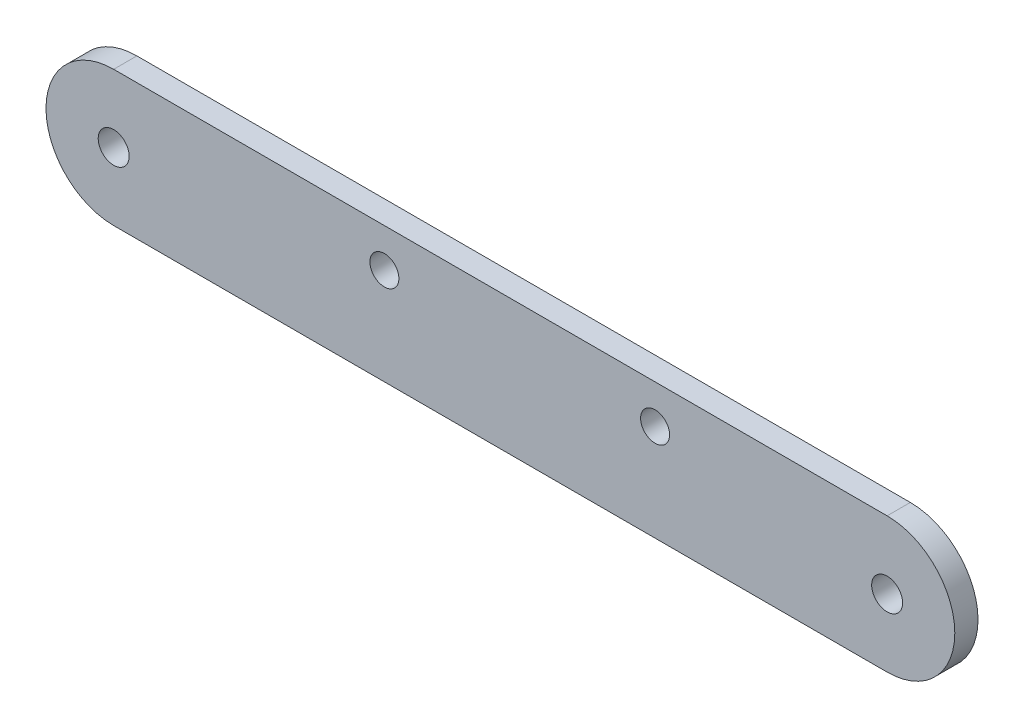
ISO-10303-21;
HEADER;
FILE_DESCRIPTION(('STEP AP214'),'2;1');
FILE_NAME('part.step','',(''),(''),'','','');
FILE_SCHEMA(('AUTOMOTIVE_DESIGN { 1 0 10303 214 1 1 1 1 }'));
ENDSEC;
DATA;
#1=APPLICATION_CONTEXT('core data for automotive mechanical design processes');
#2=APPLICATION_PROTOCOL_DEFINITION('international standard','automotive_design',2000,#1);
#3=PRODUCT_CONTEXT('',#1,'mechanical');
#4=PRODUCT('Part','Part','',(#3));
#5=PRODUCT_RELATED_PRODUCT_CATEGORY('part','',(#4));
#6=PRODUCT_DEFINITION_FORMATION('','',#4);
#7=PRODUCT_DEFINITION_CONTEXT('part definition',#1,'design');
#8=PRODUCT_DEFINITION('design','',#6,#7);
#9=PRODUCT_DEFINITION_SHAPE('','',#8);
#10=(LENGTH_UNIT() NAMED_UNIT(*) SI_UNIT(.MILLI.,.METRE.));
#11=(NAMED_UNIT(*) PLANE_ANGLE_UNIT() SI_UNIT($,.RADIAN.));
#12=(NAMED_UNIT(*) SI_UNIT($,.STERADIAN.) SOLID_ANGLE_UNIT());
#13=UNCERTAINTY_MEASURE_WITH_UNIT(LENGTH_MEASURE(1.E-05),#10,'distance_accuracy_value','');
#14=(GEOMETRIC_REPRESENTATION_CONTEXT(3) GLOBAL_UNCERTAINTY_ASSIGNED_CONTEXT((#13)) GLOBAL_UNIT_ASSIGNED_CONTEXT((#10,
#11,#12)) REPRESENTATION_CONTEXT('',''));
#15=CARTESIAN_POINT('',(0.,0.,0.));
#16=DIRECTION('',(0.,0.,1.));
#17=DIRECTION('',(1.,0.,0.));
#18=AXIS2_PLACEMENT_3D('',#15,#16,#17);
#19=CARTESIAN_POINT('',(-114.118449194835,0.,6.));
#20=DIRECTION('',(0.,0.,1.));
#21=DIRECTION('',(1.,0.,0.));
#22=AXIS2_PLACEMENT_3D('',#19,#20,#21);
#23=PLANE('',#22);
#24=CARTESIAN_POINT('',(-44.1184491948352,7.5,6.));
#25=DIRECTION('',(0.,0.,1.));
#26=DIRECTION('',(1.,0.,0.));
#27=AXIS2_PLACEMENT_3D('',#24,#25,#26);
#28=CIRCLE('',#27,3.75000000000001);
#29=CARTESIAN_POINT('',(-40.3684491948352,7.5,6.));
#30=VERTEX_POINT('',#29);
#31=EDGE_CURVE('E127',#30,#30,#28,.T.);
#32=ORIENTED_EDGE('',*,*,#31,.F.);
#33=EDGE_LOOP('',(#32));
#34=FACE_BOUND('',#33,.T.);
#35=CARTESIAN_POINT('',(25.8815508051649,7.5,6.));
#36=DIRECTION('',(0.,0.,1.));
#37=DIRECTION('',(1.,0.,0.));
#38=AXIS2_PLACEMENT_3D('',#35,#36,#37);
#39=CIRCLE('',#38,3.75000000000001);
#40=CARTESIAN_POINT('',(29.6315508051649,7.5,6.));
#41=VERTEX_POINT('',#40);
#42=EDGE_CURVE('E128',#41,#41,#39,.T.);
#43=ORIENTED_EDGE('',*,*,#42,.F.);
#44=EDGE_LOOP('',(#43));
#45=FACE_BOUND('',#44,.T.);
#46=CARTESIAN_POINT('',(-114.118449194835,0.,6.));
#47=DIRECTION('',(0.,0.,1.));
#48=DIRECTION('',(1.,0.,0.));
#49=AXIS2_PLACEMENT_3D('',#46,#47,#48);
#50=CIRCLE('',#49,4.00000000000001);
#51=CARTESIAN_POINT('',(-110.118449194835,0.,6.));
#52=VERTEX_POINT('',#51);
#53=EDGE_CURVE('E100',#52,#52,#50,.T.);
#54=ORIENTED_EDGE('',*,*,#53,.F.);
#55=EDGE_LOOP('',(#54));
#56=FACE_BOUND('',#55,.T.);
#57=CARTESIAN_POINT('',(-114.118449194835,0.,6.));
#58=DIRECTION('',(0.,0.,1.));
#59=DIRECTION('',(1.,0.,0.));
#60=AXIS2_PLACEMENT_3D('',#57,#58,#59);
#61=CIRCLE('',#60,17.5);
#62=CARTESIAN_POINT('',(-114.118449194835,17.5,6.));
#63=VERTEX_POINT('',#62);
#64=CARTESIAN_POINT('',(-114.118449194835,-17.5,6.));
#65=VERTEX_POINT('',#64);
#66=EDGE_CURVE('E85',#63,#65,#61,.T.);
#67=ORIENTED_EDGE('',*,*,#66,.T.);
#68=DIRECTION('',(1.,0.,0.));
#69=VECTOR('',#68,1.);
#70=CARTESIAN_POINT('',(-114.118449194835,-17.5,6.));
#71=LINE('',#70,#69);
#72=CARTESIAN_POINT('',(85.8815508051648,-17.5,6.));
#73=VERTEX_POINT('',#72);
#74=EDGE_CURVE('E80',#65,#73,#71,.T.);
#75=ORIENTED_EDGE('',*,*,#74,.T.);
#76=CARTESIAN_POINT('',(85.8815508051648,0.,6.));
#77=DIRECTION('',(0.,0.,1.));
#78=DIRECTION('',(1.,0.,0.));
#79=AXIS2_PLACEMENT_3D('',#76,#77,#78);
#80=CIRCLE('',#79,17.5);
#81=CARTESIAN_POINT('',(85.8815508051648,17.5,6.));
#82=VERTEX_POINT('',#81);
#83=EDGE_CURVE('E83',#73,#82,#80,.T.);
#84=ORIENTED_EDGE('',*,*,#83,.T.);
#85=DIRECTION('',(-1.,0.,0.));
#86=VECTOR('',#85,1.);
#87=CARTESIAN_POINT('',(-114.118449194835,17.5,6.));
#88=LINE('',#87,#86);
#89=EDGE_CURVE('E50',#82,#63,#88,.T.);
#90=ORIENTED_EDGE('',*,*,#89,.T.);
#91=EDGE_LOOP('',(#67,#75,#84,#90));
#92=FACE_BOUND('',#91,.T.);
#93=CARTESIAN_POINT('',(85.8815508051648,0.,6.));
#94=DIRECTION('',(0.,0.,1.));
#95=DIRECTION('',(1.,0.,0.));
#96=AXIS2_PLACEMENT_3D('',#93,#94,#95);
#97=CIRCLE('',#96,4.00000000000001);
#98=CARTESIAN_POINT('',(89.8815508051648,0.,6.));
#99=VERTEX_POINT('',#98);
#100=EDGE_CURVE('E115',#99,#99,#97,.T.);
#101=ORIENTED_EDGE('',*,*,#100,.F.);
#102=EDGE_LOOP('',(#101));
#103=FACE_BOUND('',#102,.T.);
#104=ADVANCED_FACE('F33',(#34,#45,#56,#92,#103),#23,.T.);
#105=CARTESIAN_POINT('',(-114.118449194835,0.,0.));
#106=DIRECTION('',(0.,0.,1.));
#107=DIRECTION('',(1.,0.,0.));
#108=AXIS2_PLACEMENT_3D('',#105,#106,#107);
#109=PLANE('',#108);
#110=CARTESIAN_POINT('',(-44.1184491948352,7.5,0.));
#111=DIRECTION('',(0.,0.,1.));
#112=DIRECTION('',(1.,0.,0.));
#113=AXIS2_PLACEMENT_3D('',#110,#111,#112);
#114=CIRCLE('',#113,3.75000000000001);
#115=CARTESIAN_POINT('',(-40.3684491948352,7.5,0.));
#116=VERTEX_POINT('',#115);
#117=EDGE_CURVE('E121',#116,#116,#114,.F.);
#118=ORIENTED_EDGE('',*,*,#117,.F.);
#119=EDGE_LOOP('',(#118));
#120=FACE_BOUND('',#119,.T.);
#121=CARTESIAN_POINT('',(25.8815508051649,7.5,0.));
#122=DIRECTION('',(0.,0.,1.));
#123=DIRECTION('',(1.,0.,0.));
#124=AXIS2_PLACEMENT_3D('',#121,#122,#123);
#125=CIRCLE('',#124,3.75000000000001);
#126=CARTESIAN_POINT('',(29.6315508051649,7.5,0.));
#127=VERTEX_POINT('',#126);
#128=EDGE_CURVE('E124',#127,#127,#125,.F.);
#129=ORIENTED_EDGE('',*,*,#128,.F.);
#130=EDGE_LOOP('',(#129));
#131=FACE_BOUND('',#130,.T.);
#132=CARTESIAN_POINT('',(-114.118449194835,0.,0.));
#133=DIRECTION('',(0.,0.,1.));
#134=DIRECTION('',(1.,0.,0.));
#135=AXIS2_PLACEMENT_3D('',#132,#133,#134);
#136=CIRCLE('',#135,17.5);
#137=CARTESIAN_POINT('',(-114.118449194835,17.5,0.));
#138=VERTEX_POINT('',#137);
#139=CARTESIAN_POINT('',(-114.118449194835,-17.5,0.));
#140=VERTEX_POINT('',#139);
#141=EDGE_CURVE('E97',#138,#140,#136,.T.);
#142=ORIENTED_EDGE('',*,*,#141,.F.);
#143=DIRECTION('',(-1.,0.,0.));
#144=VECTOR('',#143,1.);
#145=CARTESIAN_POINT('',(-114.118449194835,17.5,0.));
#146=LINE('',#145,#144);
#147=CARTESIAN_POINT('',(85.8815508051648,17.5,0.));
#148=VERTEX_POINT('',#147);
#149=EDGE_CURVE('E73',#148,#138,#146,.T.);
#150=ORIENTED_EDGE('',*,*,#149,.F.);
#151=CARTESIAN_POINT('',(85.8815508051648,0.,0.));
#152=DIRECTION('',(0.,0.,1.));
#153=DIRECTION('',(1.,0.,0.));
#154=AXIS2_PLACEMENT_3D('',#151,#152,#153);
#155=CIRCLE('',#154,17.5);
#156=CARTESIAN_POINT('',(85.8815508051648,-17.5,0.));
#157=VERTEX_POINT('',#156);
#158=EDGE_CURVE('E67',#157,#148,#155,.T.);
#159=ORIENTED_EDGE('',*,*,#158,.F.);
#160=DIRECTION('',(1.,0.,0.));
#161=VECTOR('',#160,1.);
#162=CARTESIAN_POINT('',(-114.118449194835,-17.5,0.));
#163=LINE('',#162,#161);
#164=EDGE_CURVE('E89',#140,#157,#163,.T.);
#165=ORIENTED_EDGE('',*,*,#164,.F.);
#166=EDGE_LOOP('',(#142,#150,#159,#165));
#167=FACE_BOUND('',#166,.T.);
#168=CARTESIAN_POINT('',(-114.118449194835,0.,0.));
#169=DIRECTION('',(0.,0.,1.));
#170=DIRECTION('',(1.,0.,0.));
#171=AXIS2_PLACEMENT_3D('',#168,#169,#170);
#172=CIRCLE('',#171,4.00000000000001);
#173=CARTESIAN_POINT('',(-110.118449194835,0.,0.));
#174=VERTEX_POINT('',#173);
#175=EDGE_CURVE('E112',#174,#174,#172,.T.);
#176=ORIENTED_EDGE('',*,*,#175,.T.);
#177=EDGE_LOOP('',(#176));
#178=FACE_BOUND('',#177,.T.);
#179=CARTESIAN_POINT('',(85.8815508051648,0.,0.));
#180=DIRECTION('',(0.,0.,1.));
#181=DIRECTION('',(1.,0.,0.));
#182=AXIS2_PLACEMENT_3D('',#179,#180,#181);
#183=CIRCLE('',#182,4.00000000000001);
#184=CARTESIAN_POINT('',(89.8815508051648,0.,0.));
#185=VERTEX_POINT('',#184);
#186=EDGE_CURVE('E118',#185,#185,#183,.T.);
#187=ORIENTED_EDGE('',*,*,#186,.T.);
#188=EDGE_LOOP('',(#187));
#189=FACE_BOUND('',#188,.T.);
#190=ADVANCED_FACE('F108',(#120,#131,#167,#178,#189),#109,.F.);
#191=CARTESIAN_POINT('',(-114.118449194835,0.,6.));
#192=DIRECTION('',(0.,0.,-1.));
#193=DIRECTION('',(-1.,0.,0.));
#194=AXIS2_PLACEMENT_3D('',#191,#192,#193);
#195=CYLINDRICAL_SURFACE('',#194,17.5);
#196=ORIENTED_EDGE('',*,*,#141,.T.);
#197=DIRECTION('',(0.,0.,-1.));
#198=VECTOR('',#197,1.);
#199=CARTESIAN_POINT('',(-114.118449194835,-17.5,6.));
#200=LINE('',#199,#198);
#201=EDGE_CURVE('E11',#65,#140,#200,.T.);
#202=ORIENTED_EDGE('',*,*,#201,.F.);
#203=ORIENTED_EDGE('',*,*,#66,.F.);
#204=DIRECTION('',(0.,0.,-1.));
#205=VECTOR('',#204,1.);
#206=CARTESIAN_POINT('',(-114.118449194835,17.5,6.));
#207=LINE('',#206,#205);
#208=EDGE_CURVE('E93',#63,#138,#207,.T.);
#209=ORIENTED_EDGE('',*,*,#208,.T.);
#210=EDGE_LOOP('',(#196,#202,#203,#209));
#211=FACE_BOUND('',#210,.T.);
#212=ADVANCED_FACE('F35',(#211),#195,.T.);
#213=CARTESIAN_POINT('',(-114.118449194835,-17.5,6.));
#214=DIRECTION('',(0.,1.,0.));
#215=DIRECTION('',(0.,0.,1.));
#216=AXIS2_PLACEMENT_3D('',#213,#214,#215);
#217=PLANE('',#216);
#218=ORIENTED_EDGE('',*,*,#164,.T.);
#219=DIRECTION('',(0.,0.,-1.));
#220=VECTOR('',#219,1.);
#221=CARTESIAN_POINT('',(85.8815508051648,-17.5,6.));
#222=LINE('',#221,#220);
#223=EDGE_CURVE('E42',#73,#157,#222,.T.);
#224=ORIENTED_EDGE('',*,*,#223,.F.);
#225=ORIENTED_EDGE('',*,*,#74,.F.);
#226=ORIENTED_EDGE('',*,*,#201,.T.);
#227=EDGE_LOOP('',(#218,#224,#225,#226));
#228=FACE_BOUND('',#227,.T.);
#229=ADVANCED_FACE('F88',(#228),#217,.F.);
#230=CARTESIAN_POINT('',(85.8815508051648,0.,6.));
#231=DIRECTION('',(0.,0.,-1.));
#232=DIRECTION('',(-1.,0.,0.));
#233=AXIS2_PLACEMENT_3D('',#230,#231,#232);
#234=CYLINDRICAL_SURFACE('',#233,17.5);
#235=ORIENTED_EDGE('',*,*,#158,.T.);
#236=DIRECTION('',(0.,0.,-1.));
#237=VECTOR('',#236,1.);
#238=CARTESIAN_POINT('',(85.8815508051648,17.5,6.));
#239=LINE('',#238,#237);
#240=EDGE_CURVE('E90',#82,#148,#239,.T.);
#241=ORIENTED_EDGE('',*,*,#240,.F.);
#242=ORIENTED_EDGE('',*,*,#83,.F.);
#243=ORIENTED_EDGE('',*,*,#223,.T.);
#244=EDGE_LOOP('',(#235,#241,#242,#243));
#245=FACE_BOUND('',#244,.T.);
#246=ADVANCED_FACE('F91',(#245),#234,.T.);
#247=CARTESIAN_POINT('',(-114.118449194835,17.5,6.));
#248=DIRECTION('',(0.,-1.,0.));
#249=DIRECTION('',(0.,0.,-1.));
#250=AXIS2_PLACEMENT_3D('',#247,#248,#249);
#251=PLANE('',#250);
#252=ORIENTED_EDGE('',*,*,#149,.T.);
#253=ORIENTED_EDGE('',*,*,#208,.F.);
#254=ORIENTED_EDGE('',*,*,#89,.F.);
#255=ORIENTED_EDGE('',*,*,#240,.T.);
#256=EDGE_LOOP('',(#252,#253,#254,#255));
#257=FACE_BOUND('',#256,.T.);
#258=ADVANCED_FACE('F105',(#257),#251,.F.);
#259=CARTESIAN_POINT('',(-114.118449194835,0.,6.));
#260=DIRECTION('',(0.,0.,-1.));
#261=DIRECTION('',(-1.,0.,0.));
#262=AXIS2_PLACEMENT_3D('',#259,#260,#261);
#263=CYLINDRICAL_SURFACE('',#262,4.00000000000001);
#264=ORIENTED_EDGE('',*,*,#53,.T.);
#265=EDGE_LOOP('',(#264));
#266=FACE_BOUND('',#265,.T.);
#267=ORIENTED_EDGE('',*,*,#175,.F.);
#268=EDGE_LOOP('',(#267));
#269=FACE_BOUND('',#268,.T.);
#270=ADVANCED_FACE('F146',(#266,#269),#263,.F.);
#271=CARTESIAN_POINT('',(85.8815508051648,0.,6.));
#272=DIRECTION('',(0.,0.,-1.));
#273=DIRECTION('',(-1.,0.,0.));
#274=AXIS2_PLACEMENT_3D('',#271,#272,#273);
#275=CYLINDRICAL_SURFACE('',#274,4.00000000000001);
#276=ORIENTED_EDGE('',*,*,#100,.T.);
#277=EDGE_LOOP('',(#276));
#278=FACE_BOUND('',#277,.T.);
#279=ORIENTED_EDGE('',*,*,#186,.F.);
#280=EDGE_LOOP('',(#279));
#281=FACE_BOUND('',#280,.T.);
#282=ADVANCED_FACE('F149',(#278,#281),#275,.F.);
#283=CARTESIAN_POINT('',(25.8815508051649,7.5,-0.00100000000000013));
#284=DIRECTION('',(0.,0.,1.));
#285=DIRECTION('',(1.,0.,0.));
#286=AXIS2_PLACEMENT_3D('',#283,#284,#285);
#287=CYLINDRICAL_SURFACE('',#286,3.75000000000001);
#288=CARTESIAN_POINT('',(29.6315508051649,7.5,6.));
#289=CARTESIAN_POINT('',(29.6315508051649,7.5,5.9375));
#290=CARTESIAN_POINT('',(29.6315508051649,7.5,5.875));
#291=CARTESIAN_POINT('',(29.6315508051649,7.5,5.75));
#292=CARTESIAN_POINT('',(29.6315508051649,7.5,5.6875));
#293=CARTESIAN_POINT('',(29.6315508051649,7.5,5.5625));
#294=CARTESIAN_POINT('',(29.6315508051649,7.5,5.5));
#295=CARTESIAN_POINT('',(29.6315508051649,7.5,5.375));
#296=CARTESIAN_POINT('',(29.6315508051649,7.5,5.3125));
#297=CARTESIAN_POINT('',(29.6315508051649,7.5,5.1875));
#298=CARTESIAN_POINT('',(29.6315508051649,7.5,5.125));
#299=CARTESIAN_POINT('',(29.6315508051649,7.5,5.));
#300=CARTESIAN_POINT('',(29.6315508051649,7.5,4.9375));
#301=CARTESIAN_POINT('',(29.6315508051649,7.5,4.8125));
#302=CARTESIAN_POINT('',(29.6315508051649,7.5,4.75));
#303=CARTESIAN_POINT('',(29.6315508051649,7.5,4.625));
#304=CARTESIAN_POINT('',(29.6315508051649,7.5,4.5625));
#305=CARTESIAN_POINT('',(29.6315508051649,7.5,4.4375));
#306=CARTESIAN_POINT('',(29.6315508051649,7.5,4.375));
#307=CARTESIAN_POINT('',(29.6315508051649,7.5,4.25));
#308=CARTESIAN_POINT('',(29.6315508051649,7.5,4.1875));
#309=CARTESIAN_POINT('',(29.6315508051649,7.5,4.0625));
#310=CARTESIAN_POINT('',(29.6315508051649,7.5,4.));
#311=CARTESIAN_POINT('',(29.6315508051649,7.5,3.875));
#312=CARTESIAN_POINT('',(29.6315508051649,7.5,3.8125));
#313=CARTESIAN_POINT('',(29.6315508051649,7.5,3.6875));
#314=CARTESIAN_POINT('',(29.6315508051649,7.5,3.625));
#315=CARTESIAN_POINT('',(29.6315508051649,7.5,3.5));
#316=CARTESIAN_POINT('',(29.6315508051649,7.5,3.4375));
#317=CARTESIAN_POINT('',(29.6315508051649,7.5,3.3125));
#318=CARTESIAN_POINT('',(29.6315508051649,7.5,3.25));
#319=CARTESIAN_POINT('',(29.6315508051649,7.5,3.125));
#320=CARTESIAN_POINT('',(29.6315508051649,7.5,3.0625));
#321=CARTESIAN_POINT('',(29.6315508051649,7.5,2.9375));
#322=CARTESIAN_POINT('',(29.6315508051649,7.5,2.875));
#323=CARTESIAN_POINT('',(29.6315508051649,7.5,2.75));
#324=CARTESIAN_POINT('',(29.6315508051649,7.5,2.6875));
#325=CARTESIAN_POINT('',(29.6315508051649,7.5,2.5625));
#326=CARTESIAN_POINT('',(29.6315508051649,7.5,2.5));
#327=CARTESIAN_POINT('',(29.6315508051649,7.5,2.375));
#328=CARTESIAN_POINT('',(29.6315508051649,7.5,2.3125));
#329=CARTESIAN_POINT('',(29.6315508051649,7.5,2.1875));
#330=CARTESIAN_POINT('',(29.6315508051649,7.5,2.125));
#331=CARTESIAN_POINT('',(29.6315508051649,7.5,2.));
#332=CARTESIAN_POINT('',(29.6315508051649,7.5,1.9375));
#333=CARTESIAN_POINT('',(29.6315508051649,7.5,1.8125));
#334=CARTESIAN_POINT('',(29.6315508051649,7.5,1.75));
#335=CARTESIAN_POINT('',(29.6315508051649,7.5,1.625));
#336=CARTESIAN_POINT('',(29.6315508051649,7.5,1.5625));
#337=CARTESIAN_POINT('',(29.6315508051649,7.5,1.4375));
#338=CARTESIAN_POINT('',(29.6315508051649,7.5,1.375));
#339=CARTESIAN_POINT('',(29.6315508051649,7.5,1.25));
#340=CARTESIAN_POINT('',(29.6315508051649,7.5,1.1875));
#341=CARTESIAN_POINT('',(29.6315508051649,7.5,1.0625));
#342=CARTESIAN_POINT('',(29.6315508051649,7.5,1.));
#343=CARTESIAN_POINT('',(29.6315508051649,7.5,0.875));
#344=CARTESIAN_POINT('',(29.6315508051649,7.5,0.8125));
#345=CARTESIAN_POINT('',(29.6315508051649,7.5,0.6875));
#346=CARTESIAN_POINT('',(29.6315508051649,7.5,0.625));
#347=CARTESIAN_POINT('',(29.6315508051649,7.5,0.5));
#348=CARTESIAN_POINT('',(29.6315508051649,7.5,0.4375));
#349=CARTESIAN_POINT('',(29.6315508051649,7.5,0.3125));
#350=CARTESIAN_POINT('',(29.6315508051649,7.5,0.25));
#351=CARTESIAN_POINT('',(29.6315508051649,7.5,0.125));
#352=CARTESIAN_POINT('',(29.6315508051649,7.5,0.0625000000000001));
#353=CARTESIAN_POINT('',(29.6315508051649,7.5,0.));
#354=B_SPLINE_CURVE_WITH_KNOTS('',3,(#288,#289,#290,#291,#292,#293,#294,#295,#296,#297,#298,
#299,#300,#301,#302,#303,#304,#305,#306,#307,#308,#309,#310,#311,#312,#313,#314,#315,#316,#317,
#318,#319,#320,#321,#322,#323,#324,#325,#326,#327,#328,#329,#330,#331,#332,#333,#334,#335,#336,
#337,#338,#339,#340,#341,#342,#343,#344,#345,#346,#347,#348,#349,#350,#351,#352,#353),
.UNSPECIFIED.,.F.,.F.,(4,2,2,2,2,2,2,2,2,2,2,2,2,2,2,2,2,2,2,2,2,2,2,2,2,2,2,2,2,2,2,2,4),(0.,
0.1875,0.375,0.5625,0.75,0.9375,1.125,1.3125,1.5,1.6875,1.875,2.0625,2.25,2.4375,2.625,2.8125,
3.,3.1875,3.375,3.5625,3.75,3.9375,4.125,4.3125,4.5,4.6875,4.875,5.0625,5.25,5.4375,5.625,
5.8125,6.),.UNSPECIFIED.);
#355=EDGE_CURVE('BSEAM159',#41,#127,#354,.T.);
#356=ORIENTED_EDGE('',*,*,#42,.T.);
#357=ORIENTED_EDGE('',*,*,#128,.T.);
#358=ORIENTED_EDGE('',*,*,#355,.T.);
#359=ORIENTED_EDGE('',*,*,#355,.F.);
#360=EDGE_LOOP('',(#356,#358,#357,#359));
#361=FACE_BOUND('',#360,.T.);
#362=ADVANCED_FACE('F159',(#361),#287,.F.);
#363=CARTESIAN_POINT('',(-44.1184491948352,7.5,-0.00100000000000013));
#364=DIRECTION('',(0.,0.,1.));
#365=DIRECTION('',(1.,0.,0.));
#366=AXIS2_PLACEMENT_3D('',#363,#364,#365);
#367=CYLINDRICAL_SURFACE('',#366,3.75000000000001);
#368=CARTESIAN_POINT('',(-40.3684491948352,7.5,6.));
#369=CARTESIAN_POINT('',(-40.3684491948352,7.5,5.9375));
#370=CARTESIAN_POINT('',(-40.3684491948352,7.5,5.875));
#371=CARTESIAN_POINT('',(-40.3684491948352,7.5,5.75));
#372=CARTESIAN_POINT('',(-40.3684491948352,7.5,5.6875));
#373=CARTESIAN_POINT('',(-40.3684491948352,7.5,5.5625));
#374=CARTESIAN_POINT('',(-40.3684491948352,7.5,5.5));
#375=CARTESIAN_POINT('',(-40.3684491948352,7.5,5.375));
#376=CARTESIAN_POINT('',(-40.3684491948352,7.5,5.3125));
#377=CARTESIAN_POINT('',(-40.3684491948352,7.5,5.1875));
#378=CARTESIAN_POINT('',(-40.3684491948352,7.5,5.125));
#379=CARTESIAN_POINT('',(-40.3684491948352,7.5,5.));
#380=CARTESIAN_POINT('',(-40.3684491948352,7.5,4.9375));
#381=CARTESIAN_POINT('',(-40.3684491948352,7.5,4.8125));
#382=CARTESIAN_POINT('',(-40.3684491948352,7.5,4.75));
#383=CARTESIAN_POINT('',(-40.3684491948352,7.5,4.625));
#384=CARTESIAN_POINT('',(-40.3684491948352,7.5,4.5625));
#385=CARTESIAN_POINT('',(-40.3684491948352,7.5,4.4375));
#386=CARTESIAN_POINT('',(-40.3684491948352,7.5,4.375));
#387=CARTESIAN_POINT('',(-40.3684491948352,7.5,4.25));
#388=CARTESIAN_POINT('',(-40.3684491948352,7.5,4.1875));
#389=CARTESIAN_POINT('',(-40.3684491948352,7.5,4.0625));
#390=CARTESIAN_POINT('',(-40.3684491948352,7.5,4.));
#391=CARTESIAN_POINT('',(-40.3684491948352,7.5,3.875));
#392=CARTESIAN_POINT('',(-40.3684491948352,7.5,3.8125));
#393=CARTESIAN_POINT('',(-40.3684491948352,7.5,3.6875));
#394=CARTESIAN_POINT('',(-40.3684491948352,7.5,3.625));
#395=CARTESIAN_POINT('',(-40.3684491948352,7.5,3.5));
#396=CARTESIAN_POINT('',(-40.3684491948352,7.5,3.4375));
#397=CARTESIAN_POINT('',(-40.3684491948352,7.5,3.3125));
#398=CARTESIAN_POINT('',(-40.3684491948352,7.5,3.25));
#399=CARTESIAN_POINT('',(-40.3684491948352,7.5,3.125));
#400=CARTESIAN_POINT('',(-40.3684491948352,7.5,3.0625));
#401=CARTESIAN_POINT('',(-40.3684491948352,7.5,2.9375));
#402=CARTESIAN_POINT('',(-40.3684491948352,7.5,2.875));
#403=CARTESIAN_POINT('',(-40.3684491948352,7.5,2.75));
#404=CARTESIAN_POINT('',(-40.3684491948352,7.5,2.6875));
#405=CARTESIAN_POINT('',(-40.3684491948352,7.5,2.5625));
#406=CARTESIAN_POINT('',(-40.3684491948352,7.5,2.5));
#407=CARTESIAN_POINT('',(-40.3684491948352,7.5,2.375));
#408=CARTESIAN_POINT('',(-40.3684491948352,7.5,2.3125));
#409=CARTESIAN_POINT('',(-40.3684491948352,7.5,2.1875));
#410=CARTESIAN_POINT('',(-40.3684491948352,7.5,2.125));
#411=CARTESIAN_POINT('',(-40.3684491948352,7.5,2.));
#412=CARTESIAN_POINT('',(-40.3684491948352,7.5,1.9375));
#413=CARTESIAN_POINT('',(-40.3684491948352,7.5,1.8125));
#414=CARTESIAN_POINT('',(-40.3684491948352,7.5,1.75));
#415=CARTESIAN_POINT('',(-40.3684491948352,7.5,1.625));
#416=CARTESIAN_POINT('',(-40.3684491948352,7.5,1.5625));
#417=CARTESIAN_POINT('',(-40.3684491948352,7.5,1.4375));
#418=CARTESIAN_POINT('',(-40.3684491948352,7.5,1.375));
#419=CARTESIAN_POINT('',(-40.3684491948352,7.5,1.25));
#420=CARTESIAN_POINT('',(-40.3684491948352,7.5,1.1875));
#421=CARTESIAN_POINT('',(-40.3684491948352,7.5,1.0625));
#422=CARTESIAN_POINT('',(-40.3684491948352,7.5,1.));
#423=CARTESIAN_POINT('',(-40.3684491948352,7.5,0.875));
#424=CARTESIAN_POINT('',(-40.3684491948352,7.5,0.8125));
#425=CARTESIAN_POINT('',(-40.3684491948352,7.5,0.6875));
#426=CARTESIAN_POINT('',(-40.3684491948352,7.5,0.625));
#427=CARTESIAN_POINT('',(-40.3684491948352,7.5,0.5));
#428=CARTESIAN_POINT('',(-40.3684491948352,7.5,0.4375));
#429=CARTESIAN_POINT('',(-40.3684491948352,7.5,0.3125));
#430=CARTESIAN_POINT('',(-40.3684491948352,7.5,0.25));
#431=CARTESIAN_POINT('',(-40.3684491948352,7.5,0.125));
#432=CARTESIAN_POINT('',(-40.3684491948352,7.5,0.0625000000000001));
#433=CARTESIAN_POINT('',(-40.3684491948352,7.5,0.));
#434=B_SPLINE_CURVE_WITH_KNOTS('',3,(#368,#369,#370,#371,#372,#373,#374,#375,#376,#377,#378,
#379,#380,#381,#382,#383,#384,#385,#386,#387,#388,#389,#390,#391,#392,#393,#394,#395,#396,#397,
#398,#399,#400,#401,#402,#403,#404,#405,#406,#407,#408,#409,#410,#411,#412,#413,#414,#415,#416,
#417,#418,#419,#420,#421,#422,#423,#424,#425,#426,#427,#428,#429,#430,#431,#432,#433),
.UNSPECIFIED.,.F.,.F.,(4,2,2,2,2,2,2,2,2,2,2,2,2,2,2,2,2,2,2,2,2,2,2,2,2,2,2,2,2,2,2,2,4),(0.,
0.1875,0.375,0.5625,0.75,0.9375,1.125,1.3125,1.5,1.6875,1.875,2.0625,2.25,2.4375,2.625,2.8125,
3.,3.1875,3.375,3.5625,3.75,3.9375,4.125,4.3125,4.5,4.6875,4.875,5.0625,5.25,5.4375,5.625,
5.8125,6.),.UNSPECIFIED.);
#435=EDGE_CURVE('BSEAM136',#30,#116,#434,.T.);
#436=ORIENTED_EDGE('',*,*,#31,.T.);
#437=ORIENTED_EDGE('',*,*,#117,.T.);
#438=ORIENTED_EDGE('',*,*,#435,.T.);
#439=ORIENTED_EDGE('',*,*,#435,.F.);
#440=EDGE_LOOP('',(#436,#438,#437,#439));
#441=FACE_BOUND('',#440,.T.);
#442=ADVANCED_FACE('F136',(#441),#367,.F.);
#443=CLOSED_SHELL('',(#104,#190,#212,#229,#246,#258,#270,#282,#362,#442));
#444=MANIFOLD_SOLID_BREP('B2',#443);
#445=ADVANCED_BREP_SHAPE_REPRESENTATION('',(#18,#444),#14);
#446=SHAPE_DEFINITION_REPRESENTATION(#9,#445);
ENDSEC;
END-ISO-10303-21;
